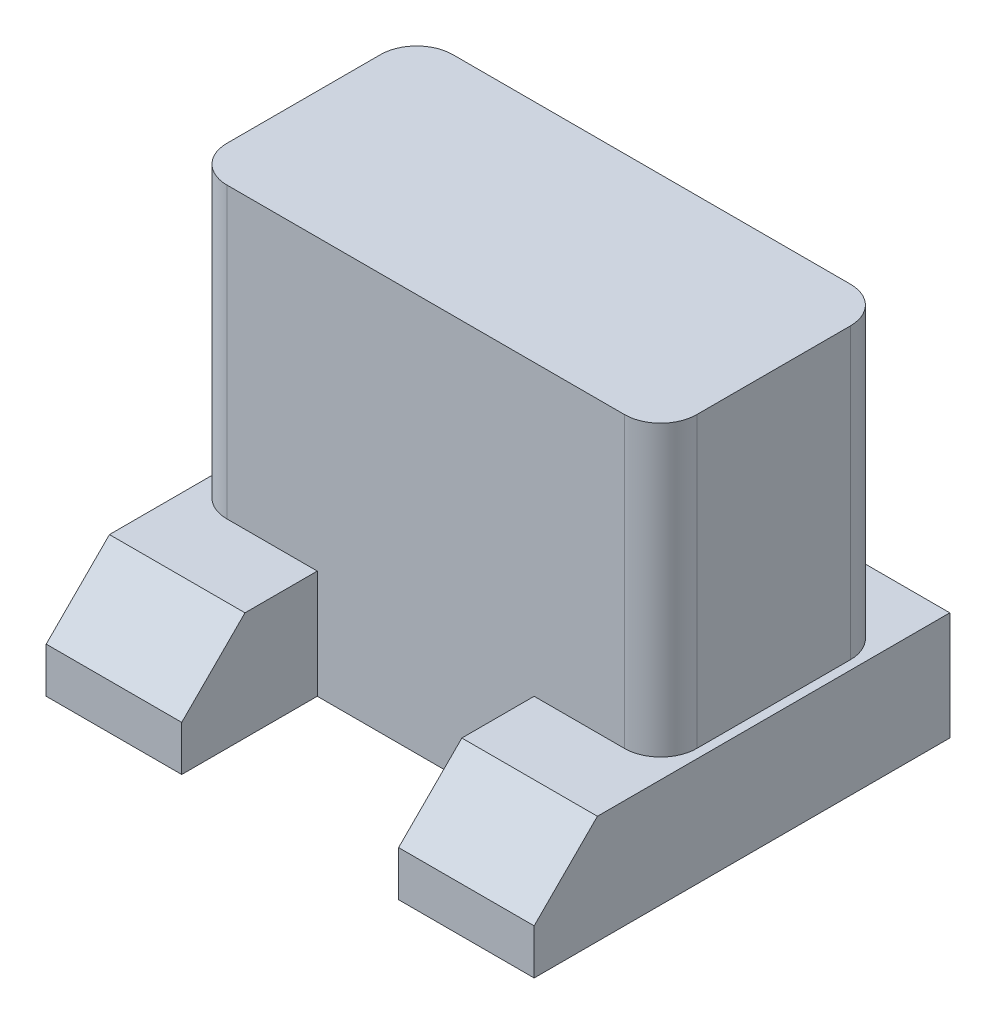
ISO-10303-21;
HEADER;
FILE_DESCRIPTION(('STEP AP214'),'2;1');
FILE_NAME('part.step','',(''),(''),'','','');
FILE_SCHEMA(('AUTOMOTIVE_DESIGN { 1 0 10303 214 1 1 1 1 }'));
ENDSEC;
DATA;
#1=APPLICATION_CONTEXT('core data for automotive mechanical design processes');
#2=APPLICATION_PROTOCOL_DEFINITION('international standard','automotive_design',2000,#1);
#3=PRODUCT_CONTEXT('',#1,'mechanical');
#4=PRODUCT('Part','Part','',(#3));
#5=PRODUCT_RELATED_PRODUCT_CATEGORY('part','',(#4));
#6=PRODUCT_DEFINITION_FORMATION('','',#4);
#7=PRODUCT_DEFINITION_CONTEXT('part definition',#1,'design');
#8=PRODUCT_DEFINITION('design','',#6,#7);
#9=PRODUCT_DEFINITION_SHAPE('','',#8);
#10=(LENGTH_UNIT() NAMED_UNIT(*) SI_UNIT(.MILLI.,.METRE.));
#11=(NAMED_UNIT(*) PLANE_ANGLE_UNIT() SI_UNIT($,.RADIAN.));
#12=(NAMED_UNIT(*) SI_UNIT($,.STERADIAN.) SOLID_ANGLE_UNIT());
#13=UNCERTAINTY_MEASURE_WITH_UNIT(LENGTH_MEASURE(1.E-05),#10,'distance_accuracy_value','');
#14=(GEOMETRIC_REPRESENTATION_CONTEXT(3) GLOBAL_UNCERTAINTY_ASSIGNED_CONTEXT((#13)) GLOBAL_UNIT_ASSIGNED_CONTEXT((#10,
#11,#12)) REPRESENTATION_CONTEXT('',''));
#15=CARTESIAN_POINT('',(0.,0.,0.));
#16=DIRECTION('',(0.,0.,1.));
#17=DIRECTION('',(1.,0.,0.));
#18=AXIS2_PLACEMENT_3D('',#15,#16,#17);
#19=CARTESIAN_POINT('',(-2.2,-1.2,1.25));
#20=DIRECTION('',(0.,0.,1.));
#21=DIRECTION('',(1.,0.,0.));
#22=AXIS2_PLACEMENT_3D('',#19,#20,#21);
#23=PLANE('',#22);
#24=DIRECTION('',(-1.,0.,0.));
#25=VECTOR('',#24,1.);
#26=CARTESIAN_POINT('',(-1.2,0.,1.25));
#27=LINE('',#26,#25);
#28=CARTESIAN_POINT('',(-1.2,0.,1.25));
#29=VERTEX_POINT('',#28);
#30=CARTESIAN_POINT('',(-2.2,0.,1.25));
#31=VERTEX_POINT('',#30);
#32=EDGE_CURVE('E216',#29,#31,#27,.T.);
#33=ORIENTED_EDGE('',*,*,#32,.F.);
#34=DIRECTION('',(0.,1.,0.));
#35=VECTOR('',#34,1.);
#36=CARTESIAN_POINT('',(-1.2,-1.2,1.25));
#37=LINE('',#36,#35);
#38=CARTESIAN_POINT('',(-1.2,-1.2,1.25));
#39=VERTEX_POINT('',#38);
#40=EDGE_CURVE('E238',#39,#29,#37,.T.);
#41=ORIENTED_EDGE('',*,*,#40,.F.);
#42=DIRECTION('',(1.,0.,0.));
#43=VECTOR('',#42,1.);
#44=CARTESIAN_POINT('',(-2.2,-1.2,1.25));
#45=LINE('',#44,#43);
#46=CARTESIAN_POINT('',(1.2,-1.2,1.25));
#47=VERTEX_POINT('',#46);
#48=EDGE_CURVE('E378',#39,#47,#45,.T.);
#49=ORIENTED_EDGE('',*,*,#48,.T.);
#50=DIRECTION('',(0.,-1.,0.));
#51=VECTOR('',#50,1.);
#52=CARTESIAN_POINT('',(1.2,0.,1.25));
#53=LINE('',#52,#51);
#54=CARTESIAN_POINT('',(1.2,0.,1.25));
#55=VERTEX_POINT('',#54);
#56=EDGE_CURVE('E249',#55,#47,#53,.T.);
#57=ORIENTED_EDGE('',*,*,#56,.F.);
#58=DIRECTION('',(-1.,0.,0.));
#59=VECTOR('',#58,1.);
#60=CARTESIAN_POINT('',(2.7,0.,1.25));
#61=LINE('',#60,#59);
#62=CARTESIAN_POINT('',(2.2,0.,1.25));
#63=VERTEX_POINT('',#62);
#64=EDGE_CURVE('E244',#63,#55,#61,.T.);
#65=ORIENTED_EDGE('',*,*,#64,.F.);
#66=DIRECTION('',(0.,1.,0.));
#67=VECTOR('',#66,1.);
#68=CARTESIAN_POINT('',(2.2,-1.2,1.25));
#69=LINE('',#68,#67);
#70=CARTESIAN_POINT('',(2.2,3.2,1.25));
#71=VERTEX_POINT('',#70);
#72=EDGE_CURVE('E388',#63,#71,#69,.T.);
#73=ORIENTED_EDGE('',*,*,#72,.T.);
#74=DIRECTION('',(1.,0.,0.));
#75=VECTOR('',#74,1.);
#76=CARTESIAN_POINT('',(-2.2,3.2,1.25));
#77=LINE('',#76,#75);
#78=CARTESIAN_POINT('',(-2.2,3.2,1.25));
#79=VERTEX_POINT('',#78);
#80=EDGE_CURVE('E363',#79,#71,#77,.T.);
#81=ORIENTED_EDGE('',*,*,#80,.F.);
#82=DIRECTION('',(0.,1.,0.));
#83=VECTOR('',#82,1.);
#84=CARTESIAN_POINT('',(-2.2,-1.2,1.25));
#85=LINE('',#84,#83);
#86=EDGE_CURVE('E386',#31,#79,#85,.T.);
#87=ORIENTED_EDGE('',*,*,#86,.F.);
#88=EDGE_LOOP('',(#33,#41,#49,#57,#65,#73,#81,#87));
#89=FACE_BOUND('',#88,.T.);
#90=ADVANCED_FACE('F35',(#89),#23,.T.);
#91=CARTESIAN_POINT('',(-2.2,-1.2,-1.25));
#92=DIRECTION('',(0.,0.,1.));
#93=DIRECTION('',(1.,0.,0.));
#94=AXIS2_PLACEMENT_3D('',#91,#92,#93);
#95=PLANE('',#94);
#96=DIRECTION('',(0.,1.,0.));
#97=VECTOR('',#96,1.);
#98=CARTESIAN_POINT('',(1.2,0.,-1.25));
#99=LINE('',#98,#97);
#100=CARTESIAN_POINT('',(1.2,-1.2,-1.25));
#101=VERTEX_POINT('',#100);
#102=CARTESIAN_POINT('',(1.2,0.,-1.25));
#103=VERTEX_POINT('',#102);
#104=EDGE_CURVE('E263',#101,#103,#99,.T.);
#105=ORIENTED_EDGE('',*,*,#104,.F.);
#106=DIRECTION('',(1.,0.,0.));
#107=VECTOR('',#106,1.);
#108=CARTESIAN_POINT('',(-2.2,-1.2,-1.25));
#109=LINE('',#108,#107);
#110=CARTESIAN_POINT('',(-1.2,-1.2,-1.25));
#111=VERTEX_POINT('',#110);
#112=EDGE_CURVE('E375',#111,#101,#109,.T.);
#113=ORIENTED_EDGE('',*,*,#112,.F.);
#114=DIRECTION('',(0.,-1.,0.));
#115=VECTOR('',#114,1.);
#116=CARTESIAN_POINT('',(-1.2,0.,-1.25));
#117=LINE('',#116,#115);
#118=CARTESIAN_POINT('',(-1.2,0.,-1.25));
#119=VERTEX_POINT('',#118);
#120=EDGE_CURVE('E285',#119,#111,#117,.T.);
#121=ORIENTED_EDGE('',*,*,#120,.F.);
#122=DIRECTION('',(1.,0.,0.));
#123=VECTOR('',#122,1.);
#124=CARTESIAN_POINT('',(-2.7,0.,-1.25));
#125=LINE('',#124,#123);
#126=CARTESIAN_POINT('',(-2.2,0.,-1.25));
#127=VERTEX_POINT('',#126);
#128=EDGE_CURVE('E282',#127,#119,#125,.T.);
#129=ORIENTED_EDGE('',*,*,#128,.F.);
#130=DIRECTION('',(0.,1.,0.));
#131=VECTOR('',#130,1.);
#132=CARTESIAN_POINT('',(-2.2,-1.2,-1.25));
#133=LINE('',#132,#131);
#134=CARTESIAN_POINT('',(-2.2,3.2,-1.25));
#135=VERTEX_POINT('',#134);
#136=EDGE_CURVE('E380',#127,#135,#133,.T.);
#137=ORIENTED_EDGE('',*,*,#136,.T.);
#138=DIRECTION('',(1.,0.,0.));
#139=VECTOR('',#138,1.);
#140=CARTESIAN_POINT('',(-2.2,3.2,-1.25));
#141=LINE('',#140,#139);
#142=CARTESIAN_POINT('',(2.2,3.2,-1.25));
#143=VERTEX_POINT('',#142);
#144=EDGE_CURVE('E351',#135,#143,#141,.T.);
#145=ORIENTED_EDGE('',*,*,#144,.T.);
#146=DIRECTION('',(0.,1.,0.));
#147=VECTOR('',#146,1.);
#148=CARTESIAN_POINT('',(2.2,-1.2,-1.25));
#149=LINE('',#148,#147);
#150=CARTESIAN_POINT('',(2.2,0.,-1.25));
#151=VERTEX_POINT('',#150);
#152=EDGE_CURVE('E394',#151,#143,#149,.T.);
#153=ORIENTED_EDGE('',*,*,#152,.F.);
#154=DIRECTION('',(1.,0.,0.));
#155=VECTOR('',#154,1.);
#156=CARTESIAN_POINT('',(2.7,0.,-1.25));
#157=LINE('',#156,#155);
#158=EDGE_CURVE('E268',#103,#151,#157,.T.);
#159=ORIENTED_EDGE('',*,*,#158,.F.);
#160=EDGE_LOOP('',(#105,#113,#121,#129,#137,#145,#153,#159));
#161=FACE_BOUND('',#160,.T.);
#162=ADVANCED_FACE('F430',(#161),#95,.F.);
#163=CARTESIAN_POINT('',(2.2,-1.2,-0.85));
#164=DIRECTION('',(0.,1.,0.));
#165=DIRECTION('',(0.,0.,1.));
#166=AXIS2_PLACEMENT_3D('',#163,#164,#165);
#167=CYLINDRICAL_SURFACE('',#166,0.4);
#168=DIRECTION('',(0.,1.,0.));
#169=VECTOR('',#168,1.);
#170=CARTESIAN_POINT('',(2.6,-1.2,-0.85));
#171=LINE('',#170,#169);
#172=CARTESIAN_POINT('',(2.6,0.,-0.85));
#173=VERTEX_POINT('',#172);
#174=CARTESIAN_POINT('',(2.6,3.2,-0.85));
#175=VERTEX_POINT('',#174);
#176=EDGE_CURVE('E392',#173,#175,#171,.T.);
#177=ORIENTED_EDGE('',*,*,#176,.F.);
#178=CARTESIAN_POINT('',(2.2,0.,-0.85));
#179=DIRECTION('',(0.,1.,0.));
#180=DIRECTION('',(0.,0.,1.));
#181=AXIS2_PLACEMENT_3D('',#178,#179,#180);
#182=CIRCLE('',#181,0.4);
#183=EDGE_CURVE('E348',#173,#151,#182,.T.);
#184=ORIENTED_EDGE('',*,*,#183,.T.);
#185=ORIENTED_EDGE('',*,*,#152,.T.);
#186=CARTESIAN_POINT('',(2.2,3.2,-0.85));
#187=DIRECTION('',(0.,-1.,0.));
#188=DIRECTION('',(0.,0.,-1.));
#189=AXIS2_PLACEMENT_3D('',#186,#187,#188);
#190=CIRCLE('',#189,0.4);
#191=EDGE_CURVE('E354',#143,#175,#190,.T.);
#192=ORIENTED_EDGE('',*,*,#191,.T.);
#193=EDGE_LOOP('',(#177,#184,#185,#192));
#194=FACE_BOUND('',#193,.T.);
#195=ADVANCED_FACE('F436',(#194),#167,.T.);
#196=CARTESIAN_POINT('',(2.6,-1.2,-0.85));
#197=DIRECTION('',(-1.,0.,0.));
#198=DIRECTION('',(0.,0.,1.));
#199=AXIS2_PLACEMENT_3D('',#196,#197,#198);
#200=PLANE('',#199);
#201=DIRECTION('',(0.,1.,0.));
#202=VECTOR('',#201,1.);
#203=CARTESIAN_POINT('',(2.6,-1.2,0.85));
#204=LINE('',#203,#202);
#205=CARTESIAN_POINT('',(2.6,0.,0.85));
#206=VERTEX_POINT('',#205);
#207=CARTESIAN_POINT('',(2.6,3.2,0.85));
#208=VERTEX_POINT('',#207);
#209=EDGE_CURVE('E390',#206,#208,#204,.T.);
#210=ORIENTED_EDGE('',*,*,#209,.F.);
#211=DIRECTION('',(0.,0.,-1.));
#212=VECTOR('',#211,1.);
#213=CARTESIAN_POINT('',(2.6,0.,-0.85));
#214=LINE('',#213,#212);
#215=EDGE_CURVE('E346',#206,#173,#214,.T.);
#216=ORIENTED_EDGE('',*,*,#215,.T.);
#217=ORIENTED_EDGE('',*,*,#176,.T.);
#218=DIRECTION('',(0.,0.,1.));
#219=VECTOR('',#218,1.);
#220=CARTESIAN_POINT('',(2.6,3.2,-0.85));
#221=LINE('',#220,#219);
#222=EDGE_CURVE('E357',#175,#208,#221,.T.);
#223=ORIENTED_EDGE('',*,*,#222,.T.);
#224=EDGE_LOOP('',(#210,#216,#217,#223));
#225=FACE_BOUND('',#224,.T.);
#226=ADVANCED_FACE('F447',(#225),#200,.F.);
#227=CARTESIAN_POINT('',(2.2,-1.2,0.85));
#228=DIRECTION('',(0.,1.,0.));
#229=DIRECTION('',(0.,0.,1.));
#230=AXIS2_PLACEMENT_3D('',#227,#228,#229);
#231=CYLINDRICAL_SURFACE('',#230,0.4);
#232=CARTESIAN_POINT('',(2.2,0.,0.85));
#233=DIRECTION('',(0.,1.,0.));
#234=DIRECTION('',(0.,0.,1.));
#235=AXIS2_PLACEMENT_3D('',#232,#233,#234);
#236=CIRCLE('',#235,0.4);
#237=EDGE_CURVE('E343',#206,#63,#236,.F.);
#238=ORIENTED_EDGE('',*,*,#237,.F.);
#239=ORIENTED_EDGE('',*,*,#209,.T.);
#240=CARTESIAN_POINT('',(2.2,3.2,0.85));
#241=DIRECTION('',(0.,1.,0.));
#242=DIRECTION('',(0.,0.,1.));
#243=AXIS2_PLACEMENT_3D('',#240,#241,#242);
#244=CIRCLE('',#243,0.4);
#245=EDGE_CURVE('E360',#71,#208,#244,.T.);
#246=ORIENTED_EDGE('',*,*,#245,.F.);
#247=ORIENTED_EDGE('',*,*,#72,.F.);
#248=EDGE_LOOP('',(#238,#239,#246,#247));
#249=FACE_BOUND('',#248,.T.);
#250=ADVANCED_FACE('F444',(#249),#231,.T.);
#251=CARTESIAN_POINT('',(-2.2,-1.2,0.85));
#252=DIRECTION('',(0.,1.,0.));
#253=DIRECTION('',(0.,0.,1.));
#254=AXIS2_PLACEMENT_3D('',#251,#252,#253);
#255=CYLINDRICAL_SURFACE('',#254,0.4);
#256=CARTESIAN_POINT('',(-2.2,0.,0.85));
#257=DIRECTION('',(0.,1.,0.));
#258=DIRECTION('',(0.,0.,1.));
#259=AXIS2_PLACEMENT_3D('',#256,#257,#258);
#260=CIRCLE('',#259,0.4);
#261=CARTESIAN_POINT('',(-2.6,0.,0.85));
#262=VERTEX_POINT('',#261);
#263=EDGE_CURVE('E340',#31,#262,#260,.F.);
#264=ORIENTED_EDGE('',*,*,#263,.F.);
#265=ORIENTED_EDGE('',*,*,#86,.T.);
#266=CARTESIAN_POINT('',(-2.2,3.2,0.85));
#267=DIRECTION('',(0.,1.,0.));
#268=DIRECTION('',(0.,0.,1.));
#269=AXIS2_PLACEMENT_3D('',#266,#267,#268);
#270=CIRCLE('',#269,0.4);
#271=CARTESIAN_POINT('',(-2.6,3.2,0.85));
#272=VERTEX_POINT('',#271);
#273=EDGE_CURVE('E366',#272,#79,#270,.T.);
#274=ORIENTED_EDGE('',*,*,#273,.F.);
#275=DIRECTION('',(0.,1.,0.));
#276=VECTOR('',#275,1.);
#277=CARTESIAN_POINT('',(-2.6,-1.2,0.85));
#278=LINE('',#277,#276);
#279=EDGE_CURVE('E384',#262,#272,#278,.T.);
#280=ORIENTED_EDGE('',*,*,#279,.F.);
#281=EDGE_LOOP('',(#264,#265,#274,#280));
#282=FACE_BOUND('',#281,.T.);
#283=ADVANCED_FACE('F442',(#282),#255,.T.);
#284=CARTESIAN_POINT('',(-2.6,-1.2,-0.85));
#285=DIRECTION('',(-1.,0.,0.));
#286=DIRECTION('',(0.,0.,1.));
#287=AXIS2_PLACEMENT_3D('',#284,#285,#286);
#288=PLANE('',#287);
#289=DIRECTION('',(0.,0.,-1.));
#290=VECTOR('',#289,1.);
#291=CARTESIAN_POINT('',(-2.6,0.,-0.85));
#292=LINE('',#291,#290);
#293=CARTESIAN_POINT('',(-2.6,0.,-0.85));
#294=VERTEX_POINT('',#293);
#295=EDGE_CURVE('E226',#262,#294,#292,.T.);
#296=ORIENTED_EDGE('',*,*,#295,.F.);
#297=ORIENTED_EDGE('',*,*,#279,.T.);
#298=DIRECTION('',(0.,0.,1.));
#299=VECTOR('',#298,1.);
#300=CARTESIAN_POINT('',(-2.6,3.2,-0.85));
#301=LINE('',#300,#299);
#302=CARTESIAN_POINT('',(-2.6,3.2,-0.85));
#303=VERTEX_POINT('',#302);
#304=EDGE_CURVE('E369',#303,#272,#301,.T.);
#305=ORIENTED_EDGE('',*,*,#304,.F.);
#306=DIRECTION('',(0.,1.,0.));
#307=VECTOR('',#306,1.);
#308=CARTESIAN_POINT('',(-2.6,-1.2,-0.85));
#309=LINE('',#308,#307);
#310=EDGE_CURVE('E382',#294,#303,#309,.T.);
#311=ORIENTED_EDGE('',*,*,#310,.F.);
#312=EDGE_LOOP('',(#296,#297,#305,#311));
#313=FACE_BOUND('',#312,.T.);
#314=ADVANCED_FACE('F537',(#313),#288,.T.);
#315=CARTESIAN_POINT('',(-2.2,-1.2,-0.85));
#316=DIRECTION('',(0.,1.,0.));
#317=DIRECTION('',(0.,0.,1.));
#318=AXIS2_PLACEMENT_3D('',#315,#316,#317);
#319=CYLINDRICAL_SURFACE('',#318,0.4);
#320=CARTESIAN_POINT('',(-2.2,0.,-0.85));
#321=DIRECTION('',(0.,1.,0.));
#322=DIRECTION('',(0.,0.,1.));
#323=AXIS2_PLACEMENT_3D('',#320,#321,#322);
#324=CIRCLE('',#323,0.4);
#325=EDGE_CURVE('E396',#294,#127,#324,.F.);
#326=ORIENTED_EDGE('',*,*,#325,.F.);
#327=ORIENTED_EDGE('',*,*,#310,.T.);
#328=CARTESIAN_POINT('',(-2.2,3.2,-0.85));
#329=DIRECTION('',(0.,1.,0.));
#330=DIRECTION('',(0.,0.,1.));
#331=AXIS2_PLACEMENT_3D('',#328,#329,#330);
#332=CIRCLE('',#331,0.4);
#333=EDGE_CURVE('E372',#135,#303,#332,.T.);
#334=ORIENTED_EDGE('',*,*,#333,.F.);
#335=ORIENTED_EDGE('',*,*,#136,.F.);
#336=EDGE_LOOP('',(#326,#327,#334,#335));
#337=FACE_BOUND('',#336,.T.);
#338=ADVANCED_FACE('F534',(#337),#319,.T.);
#339=CARTESIAN_POINT('',(2.2,-1.2,-0.85));
#340=DIRECTION('',(0.,-1.,0.));
#341=DIRECTION('',(0.,0.,-1.));
#342=AXIS2_PLACEMENT_3D('',#339,#340,#341);
#343=PLANE('',#342);
#344=DIRECTION('',(0.,0.,-1.));
#345=VECTOR('',#344,1.);
#346=CARTESIAN_POINT('',(-2.,-1.2,-0.9));
#347=LINE('',#346,#345);
#348=CARTESIAN_POINT('',(-2.,-1.2,0.6));
#349=VERTEX_POINT('',#348);
#350=CARTESIAN_POINT('',(-2.,-1.2,-0.9));
#351=VERTEX_POINT('',#350);
#352=EDGE_CURVE('E299',#349,#351,#347,.T.);
#353=ORIENTED_EDGE('',*,*,#352,.F.);
#354=DIRECTION('',(-1.,0.,0.));
#355=VECTOR('',#354,1.);
#356=CARTESIAN_POINT('',(-2.,-1.2,0.6));
#357=LINE('',#356,#355);
#358=CARTESIAN_POINT('',(2.,-1.2,0.6));
#359=VERTEX_POINT('',#358);
#360=EDGE_CURVE('E304',#359,#349,#357,.T.);
#361=ORIENTED_EDGE('',*,*,#360,.F.);
#362=DIRECTION('',(0.,0.,1.));
#363=VECTOR('',#362,1.);
#364=CARTESIAN_POINT('',(2.,-1.2,-0.9));
#365=LINE('',#364,#363);
#366=CARTESIAN_POINT('',(2.,-1.2,-0.9));
#367=VERTEX_POINT('',#366);
#368=EDGE_CURVE('E316',#367,#359,#365,.T.);
#369=ORIENTED_EDGE('',*,*,#368,.F.);
#370=DIRECTION('',(1.,0.,0.));
#371=VECTOR('',#370,1.);
#372=CARTESIAN_POINT('',(-2.,-1.2,-0.9));
#373=LINE('',#372,#371);
#374=EDGE_CURVE('E313',#351,#367,#373,.T.);
#375=ORIENTED_EDGE('',*,*,#374,.F.);
#376=EDGE_LOOP('',(#353,#361,#369,#375));
#377=FACE_BOUND('',#376,.T.);
#378=ORIENTED_EDGE('',*,*,#48,.F.);
#379=DIRECTION('',(0.,0.,-1.));
#380=VECTOR('',#379,1.);
#381=CARTESIAN_POINT('',(-1.2,-1.2,2.75));
#382=LINE('',#381,#380);
#383=CARTESIAN_POINT('',(-1.2,-1.2,2.75));
#384=VERTEX_POINT('',#383);
#385=EDGE_CURVE('E231',#384,#39,#382,.T.);
#386=ORIENTED_EDGE('',*,*,#385,.F.);
#387=DIRECTION('',(1.,0.,0.));
#388=VECTOR('',#387,1.);
#389=CARTESIAN_POINT('',(-2.7,-1.2,2.75));
#390=LINE('',#389,#388);
#391=CARTESIAN_POINT('',(-2.7,-1.2,2.75));
#392=VERTEX_POINT('',#391);
#393=EDGE_CURVE('E211',#392,#384,#390,.T.);
#394=ORIENTED_EDGE('',*,*,#393,.F.);
#395=DIRECTION('',(0.,0.,1.));
#396=VECTOR('',#395,1.);
#397=CARTESIAN_POINT('',(-2.7,-1.2,-1.25));
#398=LINE('',#397,#396);
#399=CARTESIAN_POINT('',(-2.7,-1.2,-1.85));
#400=VERTEX_POINT('',#399);
#401=EDGE_CURVE('E219',#400,#392,#398,.T.);
#402=ORIENTED_EDGE('',*,*,#401,.F.);
#403=DIRECTION('',(-1.,0.,0.));
#404=VECTOR('',#403,1.);
#405=CARTESIAN_POINT('',(-2.7,-1.2,-1.85));
#406=LINE('',#405,#404);
#407=CARTESIAN_POINT('',(-1.2,-1.2,-1.85));
#408=VERTEX_POINT('',#407);
#409=EDGE_CURVE('E289',#408,#400,#406,.T.);
#410=ORIENTED_EDGE('',*,*,#409,.F.);
#411=DIRECTION('',(0.,0.,1.));
#412=VECTOR('',#411,1.);
#413=CARTESIAN_POINT('',(-1.2,-1.2,-1.85));
#414=LINE('',#413,#412);
#415=EDGE_CURVE('E291',#408,#111,#414,.T.);
#416=ORIENTED_EDGE('',*,*,#415,.T.);
#417=ORIENTED_EDGE('',*,*,#112,.T.);
#418=DIRECTION('',(0.,0.,1.));
#419=VECTOR('',#418,1.);
#420=CARTESIAN_POINT('',(1.2,-1.2,-1.85));
#421=LINE('',#420,#419);
#422=CARTESIAN_POINT('',(1.2,-1.2,-1.85));
#423=VERTEX_POINT('',#422);
#424=EDGE_CURVE('E280',#423,#101,#421,.T.);
#425=ORIENTED_EDGE('',*,*,#424,.F.);
#426=DIRECTION('',(-1.,0.,0.));
#427=VECTOR('',#426,1.);
#428=CARTESIAN_POINT('',(2.7,-1.2,-1.85));
#429=LINE('',#428,#427);
#430=CARTESIAN_POINT('',(2.7,-1.2,-1.85));
#431=VERTEX_POINT('',#430);
#432=EDGE_CURVE('E267',#431,#423,#429,.T.);
#433=ORIENTED_EDGE('',*,*,#432,.F.);
#434=DIRECTION('',(0.,0.,-1.));
#435=VECTOR('',#434,1.);
#436=CARTESIAN_POINT('',(2.7,-1.2,-1.25));
#437=LINE('',#436,#435);
#438=CARTESIAN_POINT('',(2.7,-1.2,2.75));
#439=VERTEX_POINT('',#438);
#440=EDGE_CURVE('E227',#439,#431,#437,.T.);
#441=ORIENTED_EDGE('',*,*,#440,.F.);
#442=DIRECTION('',(1.,0.,0.));
#443=VECTOR('',#442,1.);
#444=CARTESIAN_POINT('',(1.2,-1.2,2.75));
#445=LINE('',#444,#443);
#446=CARTESIAN_POINT('',(1.2,-1.2,2.75));
#447=VERTEX_POINT('',#446);
#448=EDGE_CURVE('E251',#447,#439,#445,.T.);
#449=ORIENTED_EDGE('',*,*,#448,.F.);
#450=DIRECTION('',(0.,0.,-1.));
#451=VECTOR('',#450,1.);
#452=CARTESIAN_POINT('',(1.2,-1.2,2.75));
#453=LINE('',#452,#451);
#454=EDGE_CURVE('E254',#447,#47,#453,.T.);
#455=ORIENTED_EDGE('',*,*,#454,.T.);
#456=EDGE_LOOP('',(#378,#386,#394,#402,#410,#416,#417,#425,#433,#441,#449,#455));
#457=FACE_BOUND('',#456,.T.);
#458=ADVANCED_FACE('F230',(#377,#457),#343,.T.);
#459=CARTESIAN_POINT('',(2.2,3.2,-0.85));
#460=DIRECTION('',(0.,-1.,0.));
#461=DIRECTION('',(0.,0.,-1.));
#462=AXIS2_PLACEMENT_3D('',#459,#460,#461);
#463=PLANE('',#462);
#464=ORIENTED_EDGE('',*,*,#144,.F.);
#465=ORIENTED_EDGE('',*,*,#333,.T.);
#466=ORIENTED_EDGE('',*,*,#304,.T.);
#467=ORIENTED_EDGE('',*,*,#273,.T.);
#468=ORIENTED_EDGE('',*,*,#80,.T.);
#469=ORIENTED_EDGE('',*,*,#245,.T.);
#470=ORIENTED_EDGE('',*,*,#222,.F.);
#471=ORIENTED_EDGE('',*,*,#191,.F.);
#472=EDGE_LOOP('',(#464,#465,#466,#467,#468,#469,#470,#471));
#473=FACE_BOUND('',#472,.T.);
#474=ADVANCED_FACE('F470',(#473),#463,.F.);
#475=CARTESIAN_POINT('',(-2.7,-1.2,-1.25));
#476=DIRECTION('',(-1.,0.,0.));
#477=DIRECTION('',(0.,0.,1.));
#478=AXIS2_PLACEMENT_3D('',#475,#476,#477);
#479=PLANE('',#478);
#480=DIRECTION('',(0.,-1.,0.));
#481=VECTOR('',#480,1.);
#482=CARTESIAN_POINT('',(-2.7,0.,2.75));
#483=LINE('',#482,#481);
#484=CARTESIAN_POINT('',(-2.7,-0.699999999999999,2.75));
#485=VERTEX_POINT('',#484);
#486=EDGE_CURVE('E206',#485,#392,#483,.T.);
#487=ORIENTED_EDGE('',*,*,#486,.F.);
#488=DIRECTION('',(0.,-0.707106781186546,0.707106781186549));
#489=VECTOR('',#488,1.);
#490=CARTESIAN_POINT('',(-2.7,1.05,0.999999999999991));
#491=LINE('',#490,#489);
#492=CARTESIAN_POINT('',(-2.7,0.,2.05));
#493=VERTEX_POINT('',#492);
#494=EDGE_CURVE('E400',#485,#493,#491,.F.);
#495=ORIENTED_EDGE('',*,*,#494,.T.);
#496=DIRECTION('',(0.,0.,1.));
#497=VECTOR('',#496,1.);
#498=CARTESIAN_POINT('',(-2.7,0.,-1.25));
#499=LINE('',#498,#497);
#500=CARTESIAN_POINT('',(-2.7,0.,-1.85));
#501=VERTEX_POINT('',#500);
#502=EDGE_CURVE('E333',#501,#493,#499,.T.);
#503=ORIENTED_EDGE('',*,*,#502,.F.);
#504=DIRECTION('',(0.,1.,0.));
#505=VECTOR('',#504,1.);
#506=CARTESIAN_POINT('',(-2.7,0.,-1.85));
#507=LINE('',#506,#505);
#508=EDGE_CURVE('E222',#400,#501,#507,.T.);
#509=ORIENTED_EDGE('',*,*,#508,.F.);
#510=ORIENTED_EDGE('',*,*,#401,.T.);
#511=EDGE_LOOP('',(#487,#495,#503,#509,#510));
#512=FACE_BOUND('',#511,.T.);
#513=ADVANCED_FACE('F220',(#512),#479,.T.);
#514=CARTESIAN_POINT('',(0.,0.,0.));
#515=DIRECTION('',(0.,1.,0.));
#516=DIRECTION('',(0.,0.,1.));
#517=AXIS2_PLACEMENT_3D('',#514,#515,#516);
#518=PLANE('',#517);
#519=ORIENTED_EDGE('',*,*,#502,.T.);
#520=DIRECTION('',(1.,0.,0.));
#521=VECTOR('',#520,1.);
#522=CARTESIAN_POINT('',(0.,0.,2.05));
#523=LINE('',#522,#521);
#524=CARTESIAN_POINT('',(-1.2,0.,2.05));
#525=VERTEX_POINT('',#524);
#526=EDGE_CURVE('E402',#493,#525,#523,.T.);
#527=ORIENTED_EDGE('',*,*,#526,.T.);
#528=DIRECTION('',(0.,0.,-1.));
#529=VECTOR('',#528,1.);
#530=CARTESIAN_POINT('',(-1.2,0.,2.75));
#531=LINE('',#530,#529);
#532=EDGE_CURVE('E235',#525,#29,#531,.T.);
#533=ORIENTED_EDGE('',*,*,#532,.T.);
#534=ORIENTED_EDGE('',*,*,#32,.T.);
#535=ORIENTED_EDGE('',*,*,#263,.T.);
#536=ORIENTED_EDGE('',*,*,#295,.T.);
#537=ORIENTED_EDGE('',*,*,#325,.T.);
#538=ORIENTED_EDGE('',*,*,#128,.T.);
#539=DIRECTION('',(0.,0.,1.));
#540=VECTOR('',#539,1.);
#541=CARTESIAN_POINT('',(-1.2,0.,-1.85));
#542=LINE('',#541,#540);
#543=CARTESIAN_POINT('',(-1.2,0.,-1.85));
#544=VERTEX_POINT('',#543);
#545=EDGE_CURVE('E296',#544,#119,#542,.T.);
#546=ORIENTED_EDGE('',*,*,#545,.F.);
#547=DIRECTION('',(1.,0.,0.));
#548=VECTOR('',#547,1.);
#549=CARTESIAN_POINT('',(-2.7,0.,-1.85));
#550=LINE('',#549,#548);
#551=EDGE_CURVE('E284',#501,#544,#550,.T.);
#552=ORIENTED_EDGE('',*,*,#551,.F.);
#553=EDGE_LOOP('',(#519,#527,#533,#534,#535,#536,#537,#538,#546,#552));
#554=FACE_BOUND('',#553,.T.);
#555=ADVANCED_FACE('F484',(#554),#518,.T.);
#556=DIRECTION('',(0.,0.,-1.));
#557=VECTOR('',#556,1.);
#558=CARTESIAN_POINT('',(1.2,0.,2.75));
#559=LINE('',#558,#557);
#560=CARTESIAN_POINT('',(1.2,0.,2.05));
#561=VERTEX_POINT('',#560);
#562=EDGE_CURVE('E261',#561,#55,#559,.T.);
#563=ORIENTED_EDGE('',*,*,#562,.F.);
#564=DIRECTION('',(1.,0.,0.));
#565=VECTOR('',#564,1.);
#566=CARTESIAN_POINT('',(0.,0.,2.05));
#567=LINE('',#566,#565);
#568=CARTESIAN_POINT('',(2.7,0.,2.05));
#569=VERTEX_POINT('',#568);
#570=EDGE_CURVE('E43',#561,#569,#567,.T.);
#571=ORIENTED_EDGE('',*,*,#570,.T.);
#572=DIRECTION('',(0.,0.,-1.));
#573=VECTOR('',#572,1.);
#574=CARTESIAN_POINT('',(2.7,0.,-1.25));
#575=LINE('',#574,#573);
#576=CARTESIAN_POINT('',(2.7,0.,-1.85));
#577=VERTEX_POINT('',#576);
#578=EDGE_CURVE('E332',#569,#577,#575,.T.);
#579=ORIENTED_EDGE('',*,*,#578,.T.);
#580=DIRECTION('',(1.,0.,0.));
#581=VECTOR('',#580,1.);
#582=CARTESIAN_POINT('',(2.7,0.,-1.85));
#583=LINE('',#582,#581);
#584=CARTESIAN_POINT('',(1.2,0.,-1.85));
#585=VERTEX_POINT('',#584);
#586=EDGE_CURVE('E272',#585,#577,#583,.T.);
#587=ORIENTED_EDGE('',*,*,#586,.F.);
#588=DIRECTION('',(0.,0.,1.));
#589=VECTOR('',#588,1.);
#590=CARTESIAN_POINT('',(1.2,0.,-1.85));
#591=LINE('',#590,#589);
#592=EDGE_CURVE('E275',#585,#103,#591,.T.);
#593=ORIENTED_EDGE('',*,*,#592,.T.);
#594=ORIENTED_EDGE('',*,*,#158,.T.);
#595=ORIENTED_EDGE('',*,*,#183,.F.);
#596=ORIENTED_EDGE('',*,*,#215,.F.);
#597=ORIENTED_EDGE('',*,*,#237,.T.);
#598=ORIENTED_EDGE('',*,*,#64,.T.);
#599=EDGE_LOOP('',(#563,#571,#579,#587,#593,#594,#595,#596,#597,#598));
#600=FACE_BOUND('',#599,.T.);
#601=ADVANCED_FACE('F462',(#600),#518,.T.);
#602=CARTESIAN_POINT('',(2.7,-1.2,-1.25));
#603=DIRECTION('',(1.,0.,0.));
#604=DIRECTION('',(0.,0.,-1.));
#605=AXIS2_PLACEMENT_3D('',#602,#603,#604);
#606=PLANE('',#605);
#607=ORIENTED_EDGE('',*,*,#578,.F.);
#608=DIRECTION('',(0.,0.707106781186546,-0.707106781186549));
#609=VECTOR('',#608,1.);
#610=CARTESIAN_POINT('',(2.7,1.05,0.999999999999991));
#611=LINE('',#610,#609);
#612=CARTESIAN_POINT('',(2.7,-0.699999999999999,2.75));
#613=VERTEX_POINT('',#612);
#614=EDGE_CURVE('E11',#569,#613,#611,.F.);
#615=ORIENTED_EDGE('',*,*,#614,.T.);
#616=DIRECTION('',(0.,1.,0.));
#617=VECTOR('',#616,1.);
#618=CARTESIAN_POINT('',(2.7,-1.2,2.75));
#619=LINE('',#618,#617);
#620=EDGE_CURVE('E245',#439,#613,#619,.T.);
#621=ORIENTED_EDGE('',*,*,#620,.F.);
#622=ORIENTED_EDGE('',*,*,#440,.T.);
#623=DIRECTION('',(0.,-1.,0.));
#624=VECTOR('',#623,1.);
#625=CARTESIAN_POINT('',(2.7,0.,-1.85));
#626=LINE('',#625,#624);
#627=EDGE_CURVE('E264',#577,#431,#626,.T.);
#628=ORIENTED_EDGE('',*,*,#627,.F.);
#629=EDGE_LOOP('',(#607,#615,#621,#622,#628));
#630=FACE_BOUND('',#629,.T.);
#631=ADVANCED_FACE('F421',(#630),#606,.T.);
#632=CARTESIAN_POINT('',(-2.,-1.7,-0.9));
#633=DIRECTION('',(1.,0.,0.));
#634=DIRECTION('',(0.,0.,-1.));
#635=AXIS2_PLACEMENT_3D('',#632,#633,#634);
#636=PLANE('',#635);
#637=ORIENTED_EDGE('',*,*,#352,.T.);
#638=DIRECTION('',(0.,1.,0.));
#639=VECTOR('',#638,1.);
#640=CARTESIAN_POINT('',(-2.,-1.7,-0.9));
#641=LINE('',#640,#639);
#642=CARTESIAN_POINT('',(-2.,-1.7,-0.9));
#643=VERTEX_POINT('',#642);
#644=EDGE_CURVE('E329',#643,#351,#641,.T.);
#645=ORIENTED_EDGE('',*,*,#644,.F.);
#646=DIRECTION('',(0.,0.,-1.));
#647=VECTOR('',#646,1.);
#648=CARTESIAN_POINT('',(-2.,-1.7,-0.9));
#649=LINE('',#648,#647);
#650=CARTESIAN_POINT('',(-2.,-1.7,0.6));
#651=VERTEX_POINT('',#650);
#652=EDGE_CURVE('E300',#651,#643,#649,.T.);
#653=ORIENTED_EDGE('',*,*,#652,.F.);
#654=DIRECTION('',(0.,1.,0.));
#655=VECTOR('',#654,1.);
#656=CARTESIAN_POINT('',(-2.,-1.7,0.6));
#657=LINE('',#656,#655);
#658=EDGE_CURVE('E310',#651,#349,#657,.T.);
#659=ORIENTED_EDGE('',*,*,#658,.T.);
#660=EDGE_LOOP('',(#637,#645,#653,#659));
#661=FACE_BOUND('',#660,.T.);
#662=ADVANCED_FACE('F519',(#661),#636,.F.);
#663=CARTESIAN_POINT('',(-2.,-1.7,-0.9));
#664=DIRECTION('',(0.,0.,1.));
#665=DIRECTION('',(1.,0.,0.));
#666=AXIS2_PLACEMENT_3D('',#663,#664,#665);
#667=PLANE('',#666);
#668=ORIENTED_EDGE('',*,*,#374,.T.);
#669=DIRECTION('',(0.,1.,0.));
#670=VECTOR('',#669,1.);
#671=CARTESIAN_POINT('',(2.,-1.7,-0.9));
#672=LINE('',#671,#670);
#673=CARTESIAN_POINT('',(2.,-1.7,-0.9));
#674=VERTEX_POINT('',#673);
#675=EDGE_CURVE('E326',#674,#367,#672,.T.);
#676=ORIENTED_EDGE('',*,*,#675,.F.);
#677=DIRECTION('',(1.,0.,0.));
#678=VECTOR('',#677,1.);
#679=CARTESIAN_POINT('',(-2.,-1.7,-0.9));
#680=LINE('',#679,#678);
#681=EDGE_CURVE('E303',#643,#674,#680,.T.);
#682=ORIENTED_EDGE('',*,*,#681,.F.);
#683=ORIENTED_EDGE('',*,*,#644,.T.);
#684=EDGE_LOOP('',(#668,#676,#682,#683));
#685=FACE_BOUND('',#684,.T.);
#686=ADVANCED_FACE('F515',(#685),#667,.F.);
#687=CARTESIAN_POINT('',(2.,-1.7,-0.9));
#688=DIRECTION('',(-1.,0.,0.));
#689=DIRECTION('',(0.,0.,1.));
#690=AXIS2_PLACEMENT_3D('',#687,#688,#689);
#691=PLANE('',#690);
#692=ORIENTED_EDGE('',*,*,#368,.T.);
#693=DIRECTION('',(0.,1.,0.));
#694=VECTOR('',#693,1.);
#695=CARTESIAN_POINT('',(2.,-1.7,0.6));
#696=LINE('',#695,#694);
#697=CARTESIAN_POINT('',(2.,-1.7,0.6));
#698=VERTEX_POINT('',#697);
#699=EDGE_CURVE('E323',#698,#359,#696,.T.);
#700=ORIENTED_EDGE('',*,*,#699,.F.);
#701=DIRECTION('',(0.,0.,1.));
#702=VECTOR('',#701,1.);
#703=CARTESIAN_POINT('',(2.,-1.7,-0.9));
#704=LINE('',#703,#702);
#705=EDGE_CURVE('E306',#674,#698,#704,.T.);
#706=ORIENTED_EDGE('',*,*,#705,.F.);
#707=ORIENTED_EDGE('',*,*,#675,.T.);
#708=EDGE_LOOP('',(#692,#700,#706,#707));
#709=FACE_BOUND('',#708,.T.);
#710=ADVANCED_FACE('F511',(#709),#691,.F.);
#711=CARTESIAN_POINT('',(-2.,-1.7,0.6));
#712=DIRECTION('',(0.,0.,-1.));
#713=DIRECTION('',(-1.,0.,0.));
#714=AXIS2_PLACEMENT_3D('',#711,#712,#713);
#715=PLANE('',#714);
#716=ORIENTED_EDGE('',*,*,#360,.T.);
#717=ORIENTED_EDGE('',*,*,#658,.F.);
#718=DIRECTION('',(-1.,0.,0.));
#719=VECTOR('',#718,1.);
#720=CARTESIAN_POINT('',(-2.,-1.7,0.6));
#721=LINE('',#720,#719);
#722=EDGE_CURVE('E308',#698,#651,#721,.T.);
#723=ORIENTED_EDGE('',*,*,#722,.F.);
#724=ORIENTED_EDGE('',*,*,#699,.T.);
#725=EDGE_LOOP('',(#716,#717,#723,#724));
#726=FACE_BOUND('',#725,.T.);
#727=ADVANCED_FACE('F504',(#726),#715,.F.);
#728=CARTESIAN_POINT('',(0.,-1.7,0.));
#729=DIRECTION('',(0.,1.,0.));
#730=DIRECTION('',(0.,0.,1.));
#731=AXIS2_PLACEMENT_3D('',#728,#729,#730);
#732=PLANE('',#731);
#733=ORIENTED_EDGE('',*,*,#652,.T.);
#734=ORIENTED_EDGE('',*,*,#681,.T.);
#735=ORIENTED_EDGE('',*,*,#705,.T.);
#736=ORIENTED_EDGE('',*,*,#722,.T.);
#737=EDGE_LOOP('',(#733,#734,#735,#736));
#738=FACE_BOUND('',#737,.T.);
#739=ADVANCED_FACE('F496',(#738),#732,.F.);
#740=CARTESIAN_POINT('',(-1.2,0.,-1.85));
#741=DIRECTION('',(-1.,0.,0.));
#742=DIRECTION('',(0.,-1.,0.));
#743=AXIS2_PLACEMENT_3D('',#740,#741,#742);
#744=PLANE('',#743);
#745=ORIENTED_EDGE('',*,*,#120,.T.);
#746=ORIENTED_EDGE('',*,*,#415,.F.);
#747=DIRECTION('',(0.,-1.,0.));
#748=VECTOR('',#747,1.);
#749=CARTESIAN_POINT('',(-1.2,0.,-1.85));
#750=LINE('',#749,#748);
#751=EDGE_CURVE('E287',#544,#408,#750,.T.);
#752=ORIENTED_EDGE('',*,*,#751,.F.);
#753=ORIENTED_EDGE('',*,*,#545,.T.);
#754=EDGE_LOOP('',(#745,#746,#752,#753));
#755=FACE_BOUND('',#754,.T.);
#756=ADVANCED_FACE('F494',(#755),#744,.F.);
#757=CARTESIAN_POINT('',(0.,0.,-1.85));
#758=DIRECTION('',(0.,0.,1.));
#759=DIRECTION('',(1.,0.,0.));
#760=AXIS2_PLACEMENT_3D('',#757,#758,#759);
#761=PLANE('',#760);
#762=ORIENTED_EDGE('',*,*,#508,.T.);
#763=ORIENTED_EDGE('',*,*,#551,.T.);
#764=ORIENTED_EDGE('',*,*,#751,.T.);
#765=ORIENTED_EDGE('',*,*,#409,.T.);
#766=EDGE_LOOP('',(#762,#763,#764,#765));
#767=FACE_BOUND('',#766,.T.);
#768=ADVANCED_FACE('F488',(#767),#761,.F.);
#769=CARTESIAN_POINT('',(1.2,0.,-1.85));
#770=DIRECTION('',(1.,0.,0.));
#771=DIRECTION('',(0.,1.,0.));
#772=AXIS2_PLACEMENT_3D('',#769,#770,#771);
#773=PLANE('',#772);
#774=ORIENTED_EDGE('',*,*,#104,.T.);
#775=ORIENTED_EDGE('',*,*,#592,.F.);
#776=DIRECTION('',(0.,1.,0.));
#777=VECTOR('',#776,1.);
#778=CARTESIAN_POINT('',(1.2,0.,-1.85));
#779=LINE('',#778,#777);
#780=EDGE_CURVE('E270',#423,#585,#779,.T.);
#781=ORIENTED_EDGE('',*,*,#780,.F.);
#782=ORIENTED_EDGE('',*,*,#424,.T.);
#783=EDGE_LOOP('',(#774,#775,#781,#782));
#784=FACE_BOUND('',#783,.T.);
#785=ADVANCED_FACE('F502',(#784),#773,.F.);
#786=CARTESIAN_POINT('',(0.,0.,-1.85));
#787=DIRECTION('',(0.,0.,-1.));
#788=DIRECTION('',(-1.,0.,0.));
#789=AXIS2_PLACEMENT_3D('',#786,#787,#788);
#790=PLANE('',#789);
#791=ORIENTED_EDGE('',*,*,#627,.T.);
#792=ORIENTED_EDGE('',*,*,#432,.T.);
#793=ORIENTED_EDGE('',*,*,#780,.T.);
#794=ORIENTED_EDGE('',*,*,#586,.T.);
#795=EDGE_LOOP('',(#791,#792,#793,#794));
#796=FACE_BOUND('',#795,.T.);
#797=ADVANCED_FACE('F639',(#796),#790,.T.);
#798=CARTESIAN_POINT('',(1.2,0.,2.75));
#799=DIRECTION('',(1.,0.,0.));
#800=DIRECTION('',(0.,1.,0.));
#801=AXIS2_PLACEMENT_3D('',#798,#799,#800);
#802=PLANE('',#801);
#803=DIRECTION('',(0.,-1.,0.));
#804=VECTOR('',#803,1.);
#805=CARTESIAN_POINT('',(1.2,0.,2.75));
#806=LINE('',#805,#804);
#807=CARTESIAN_POINT('',(1.2,-0.699999999999999,2.75));
#808=VERTEX_POINT('',#807);
#809=EDGE_CURVE('E248',#808,#447,#806,.T.);
#810=ORIENTED_EDGE('',*,*,#809,.F.);
#811=DIRECTION('',(0.,-0.707106781186546,0.707106781186549));
#812=VECTOR('',#811,1.);
#813=CARTESIAN_POINT('',(1.2,-0.699999999999999,2.75));
#814=LINE('',#813,#812);
#815=EDGE_CURVE('E57',#808,#561,#814,.F.);
#816=ORIENTED_EDGE('',*,*,#815,.T.);
#817=ORIENTED_EDGE('',*,*,#562,.T.);
#818=ORIENTED_EDGE('',*,*,#56,.T.);
#819=ORIENTED_EDGE('',*,*,#454,.F.);
#820=EDGE_LOOP('',(#810,#816,#817,#818,#819));
#821=FACE_BOUND('',#820,.T.);
#822=ADVANCED_FACE('F416',(#821),#802,.F.);
#823=CARTESIAN_POINT('',(0.,0.,2.75));
#824=DIRECTION('',(0.,0.,1.));
#825=DIRECTION('',(1.,0.,0.));
#826=AXIS2_PLACEMENT_3D('',#823,#824,#825);
#827=PLANE('',#826);
#828=ORIENTED_EDGE('',*,*,#620,.T.);
#829=DIRECTION('',(-1.,0.,0.));
#830=VECTOR('',#829,1.);
#831=CARTESIAN_POINT('',(0.,-0.699999999999999,2.75));
#832=LINE('',#831,#830);
#833=EDGE_CURVE('E406',#613,#808,#832,.T.);
#834=ORIENTED_EDGE('',*,*,#833,.T.);
#835=ORIENTED_EDGE('',*,*,#809,.T.);
#836=ORIENTED_EDGE('',*,*,#448,.T.);
#837=EDGE_LOOP('',(#828,#834,#835,#836));
#838=FACE_BOUND('',#837,.T.);
#839=ADVANCED_FACE('F411',(#838),#827,.T.);
#840=CARTESIAN_POINT('',(-1.2,-1.2,2.75));
#841=DIRECTION('',(-1.,0.,0.));
#842=DIRECTION('',(0.,-1.,0.));
#843=AXIS2_PLACEMENT_3D('',#840,#841,#842);
#844=PLANE('',#843);
#845=ORIENTED_EDGE('',*,*,#532,.F.);
#846=DIRECTION('',(0.,0.707106781186546,-0.707106781186549));
#847=VECTOR('',#846,1.);
#848=CARTESIAN_POINT('',(-1.2,-0.699999999999999,2.75));
#849=LINE('',#848,#847);
#850=CARTESIAN_POINT('',(-1.2,-0.699999999999999,2.75));
#851=VERTEX_POINT('',#850);
#852=EDGE_CURVE('E404',#525,#851,#849,.F.);
#853=ORIENTED_EDGE('',*,*,#852,.T.);
#854=DIRECTION('',(0.,1.,0.));
#855=VECTOR('',#854,1.);
#856=CARTESIAN_POINT('',(-1.2,-1.2,2.75));
#857=LINE('',#856,#855);
#858=EDGE_CURVE('E233',#384,#851,#857,.T.);
#859=ORIENTED_EDGE('',*,*,#858,.F.);
#860=ORIENTED_EDGE('',*,*,#385,.T.);
#861=ORIENTED_EDGE('',*,*,#40,.T.);
#862=EDGE_LOOP('',(#845,#853,#859,#860,#861));
#863=FACE_BOUND('',#862,.T.);
#864=ADVANCED_FACE('F479',(#863),#844,.F.);
#865=CARTESIAN_POINT('',(0.,0.,2.75));
#866=DIRECTION('',(0.,0.,1.));
#867=DIRECTION('',(1.,0.,0.));
#868=AXIS2_PLACEMENT_3D('',#865,#866,#867);
#869=PLANE('',#868);
#870=ORIENTED_EDGE('',*,*,#858,.T.);
#871=DIRECTION('',(-1.,0.,0.));
#872=VECTOR('',#871,1.);
#873=CARTESIAN_POINT('',(0.,-0.699999999999999,2.75));
#874=LINE('',#873,#872);
#875=EDGE_CURVE('E214',#851,#485,#874,.T.);
#876=ORIENTED_EDGE('',*,*,#875,.T.);
#877=ORIENTED_EDGE('',*,*,#486,.T.);
#878=ORIENTED_EDGE('',*,*,#393,.T.);
#879=EDGE_LOOP('',(#870,#876,#877,#878));
#880=FACE_BOUND('',#879,.T.);
#881=ADVANCED_FACE('F209',(#880),#869,.T.);
#882=CARTESIAN_POINT('',(0.,-0.699999999999999,2.75));
#883=DIRECTION('',(0.,-0.707106781186549,-0.707106781186546));
#884=DIRECTION('',(-1.,0.,0.));
#885=AXIS2_PLACEMENT_3D('',#882,#883,#884);
#886=PLANE('',#885);
#887=ORIENTED_EDGE('',*,*,#852,.F.);
#888=ORIENTED_EDGE('',*,*,#526,.F.);
#889=ORIENTED_EDGE('',*,*,#494,.F.);
#890=ORIENTED_EDGE('',*,*,#875,.F.);
#891=EDGE_LOOP('',(#887,#888,#889,#890));
#892=FACE_BOUND('',#891,.T.);
#893=ADVANCED_FACE('F424',(#892),#886,.F.);
#894=CARTESIAN_POINT('',(0.,-0.699999999999999,2.75));
#895=DIRECTION('',(0.,-0.707106781186549,-0.707106781186546));
#896=DIRECTION('',(-1.,0.,0.));
#897=AXIS2_PLACEMENT_3D('',#894,#895,#896);
#898=PLANE('',#897);
#899=ORIENTED_EDGE('',*,*,#614,.F.);
#900=ORIENTED_EDGE('',*,*,#570,.F.);
#901=ORIENTED_EDGE('',*,*,#815,.F.);
#902=ORIENTED_EDGE('',*,*,#833,.F.);
#903=EDGE_LOOP('',(#899,#900,#901,#902));
#904=FACE_BOUND('',#903,.T.);
#905=ADVANCED_FACE('F37',(#904),#898,.F.);
#906=CLOSED_SHELL('',(#90,#162,#195,#226,#250,#283,#314,#338,#458,#474,#513,#555,#601,#631,#662,
#686,#710,#727,#739,#756,#768,#785,#797,#822,#839,#864,#881,#893,#905));
#907=MANIFOLD_SOLID_BREP('B2',#906);
#908=ADVANCED_BREP_SHAPE_REPRESENTATION('',(#18,#907),#14);
#909=SHAPE_DEFINITION_REPRESENTATION(#9,#908);
ENDSEC;
END-ISO-10303-21;
